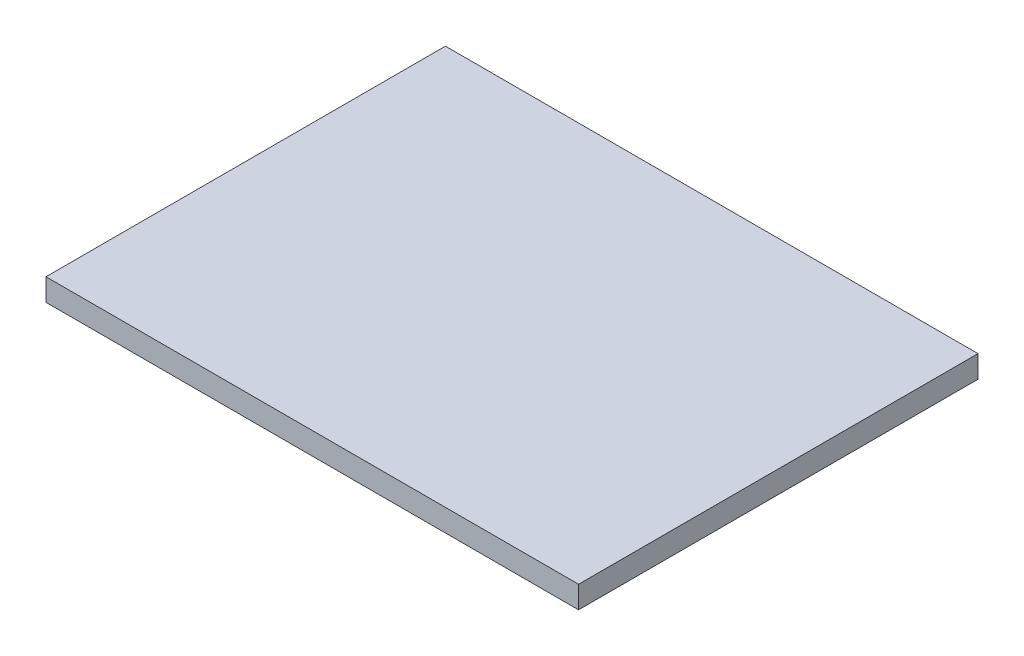
ISO-10303-21;
HEADER;
FILE_DESCRIPTION(('STEP AP214'),'2;1');
FILE_NAME('part.step','',(''),(''),'','','');
FILE_SCHEMA(('AUTOMOTIVE_DESIGN { 1 0 10303 214 1 1 1 1 }'));
ENDSEC;
DATA;
#1=APPLICATION_CONTEXT('core data for automotive mechanical design processes');
#2=APPLICATION_PROTOCOL_DEFINITION('international standard','automotive_design',2000,#1);
#3=PRODUCT_CONTEXT('',#1,'mechanical');
#4=PRODUCT('Part','Part','',(#3));
#5=PRODUCT_RELATED_PRODUCT_CATEGORY('part','',(#4));
#6=PRODUCT_DEFINITION_FORMATION('','',#4);
#7=PRODUCT_DEFINITION_CONTEXT('part definition',#1,'design');
#8=PRODUCT_DEFINITION('design','',#6,#7);
#9=PRODUCT_DEFINITION_SHAPE('','',#8);
#10=(LENGTH_UNIT() NAMED_UNIT(*) SI_UNIT(.MILLI.,.METRE.));
#11=(NAMED_UNIT(*) PLANE_ANGLE_UNIT() SI_UNIT($,.RADIAN.));
#12=(NAMED_UNIT(*) SI_UNIT($,.STERADIAN.) SOLID_ANGLE_UNIT());
#13=UNCERTAINTY_MEASURE_WITH_UNIT(LENGTH_MEASURE(1.E-05),#10,'distance_accuracy_value','');
#14=(GEOMETRIC_REPRESENTATION_CONTEXT(3) GLOBAL_UNCERTAINTY_ASSIGNED_CONTEXT((#13)) GLOBAL_UNIT_ASSIGNED_CONTEXT((#10,
#11,#12)) REPRESENTATION_CONTEXT('',''));
#15=CARTESIAN_POINT('',(0.,0.,0.));
#16=DIRECTION('',(0.,0.,1.));
#17=DIRECTION('',(1.,0.,0.));
#18=AXIS2_PLACEMENT_3D('',#15,#16,#17);
#19=CARTESIAN_POINT('',(-60.,5.,-45.));
#20=DIRECTION('',(1.,0.,0.));
#21=DIRECTION('',(0.,0.,-1.));
#22=AXIS2_PLACEMENT_3D('',#19,#20,#21);
#23=PLANE('',#22);
#24=DIRECTION('',(0.,0.,1.));
#25=VECTOR('',#24,1.);
#26=CARTESIAN_POINT('',(-60.,0.,-45.));
#27=LINE('',#26,#25);
#28=CARTESIAN_POINT('',(-60.,0.,-45.));
#29=VERTEX_POINT('',#28);
#30=CARTESIAN_POINT('',(-60.,0.,45.));
#31=VERTEX_POINT('',#30);
#32=EDGE_CURVE('E102',#29,#31,#27,.T.);
#33=ORIENTED_EDGE('',*,*,#32,.T.);
#34=DIRECTION('',(0.,-1.,0.));
#35=VECTOR('',#34,1.);
#36=CARTESIAN_POINT('',(-60.,5.,45.));
#37=LINE('',#36,#35);
#38=CARTESIAN_POINT('',(-60.,5.,45.));
#39=VERTEX_POINT('',#38);
#40=EDGE_CURVE('E11',#39,#31,#37,.T.);
#41=ORIENTED_EDGE('',*,*,#40,.F.);
#42=DIRECTION('',(0.,0.,1.));
#43=VECTOR('',#42,1.);
#44=CARTESIAN_POINT('',(-60.,5.,-45.));
#45=LINE('',#44,#43);
#46=CARTESIAN_POINT('',(-60.,5.,-45.));
#47=VERTEX_POINT('',#46);
#48=EDGE_CURVE('E90',#47,#39,#45,.T.);
#49=ORIENTED_EDGE('',*,*,#48,.F.);
#50=DIRECTION('',(0.,-1.,0.));
#51=VECTOR('',#50,1.);
#52=CARTESIAN_POINT('',(-60.,5.,-45.));
#53=LINE('',#52,#51);
#54=EDGE_CURVE('E98',#47,#29,#53,.T.);
#55=ORIENTED_EDGE('',*,*,#54,.T.);
#56=EDGE_LOOP('',(#33,#41,#49,#55));
#57=FACE_BOUND('',#56,.T.);
#58=ADVANCED_FACE('F39',(#57),#23,.F.);
#59=CARTESIAN_POINT('',(-60.,5.,45.));
#60=DIRECTION('',(0.,0.,-1.));
#61=DIRECTION('',(-1.,0.,0.));
#62=AXIS2_PLACEMENT_3D('',#59,#60,#61);
#63=PLANE('',#62);
#64=DIRECTION('',(1.,0.,0.));
#65=VECTOR('',#64,1.);
#66=CARTESIAN_POINT('',(-60.,0.,45.));
#67=LINE('',#66,#65);
#68=CARTESIAN_POINT('',(60.,0.,45.));
#69=VERTEX_POINT('',#68);
#70=EDGE_CURVE('E94',#31,#69,#67,.T.);
#71=ORIENTED_EDGE('',*,*,#70,.T.);
#72=DIRECTION('',(0.,-1.,0.));
#73=VECTOR('',#72,1.);
#74=CARTESIAN_POINT('',(60.,5.,45.));
#75=LINE('',#74,#73);
#76=CARTESIAN_POINT('',(60.,5.,45.));
#77=VERTEX_POINT('',#76);
#78=EDGE_CURVE('E47',#77,#69,#75,.T.);
#79=ORIENTED_EDGE('',*,*,#78,.F.);
#80=DIRECTION('',(1.,0.,0.));
#81=VECTOR('',#80,1.);
#82=CARTESIAN_POINT('',(-60.,5.,45.));
#83=LINE('',#82,#81);
#84=EDGE_CURVE('E85',#39,#77,#83,.T.);
#85=ORIENTED_EDGE('',*,*,#84,.F.);
#86=ORIENTED_EDGE('',*,*,#40,.T.);
#87=EDGE_LOOP('',(#71,#79,#85,#86));
#88=FACE_BOUND('',#87,.T.);
#89=ADVANCED_FACE('F93',(#88),#63,.F.);
#90=CARTESIAN_POINT('',(60.,5.,-45.));
#91=DIRECTION('',(-1.,0.,0.));
#92=DIRECTION('',(0.,0.,1.));
#93=AXIS2_PLACEMENT_3D('',#90,#91,#92);
#94=PLANE('',#93);
#95=DIRECTION('',(0.,0.,-1.));
#96=VECTOR('',#95,1.);
#97=CARTESIAN_POINT('',(60.,0.,-45.));
#98=LINE('',#97,#96);
#99=CARTESIAN_POINT('',(60.,0.,-45.));
#100=VERTEX_POINT('',#99);
#101=EDGE_CURVE('E72',#69,#100,#98,.T.);
#102=ORIENTED_EDGE('',*,*,#101,.T.);
#103=DIRECTION('',(0.,-1.,0.));
#104=VECTOR('',#103,1.);
#105=CARTESIAN_POINT('',(60.,5.,-45.));
#106=LINE('',#105,#104);
#107=CARTESIAN_POINT('',(60.,5.,-45.));
#108=VERTEX_POINT('',#107);
#109=EDGE_CURVE('E95',#108,#100,#106,.T.);
#110=ORIENTED_EDGE('',*,*,#109,.F.);
#111=DIRECTION('',(0.,0.,-1.));
#112=VECTOR('',#111,1.);
#113=CARTESIAN_POINT('',(60.,5.,-45.));
#114=LINE('',#113,#112);
#115=EDGE_CURVE('E88',#77,#108,#114,.T.);
#116=ORIENTED_EDGE('',*,*,#115,.F.);
#117=ORIENTED_EDGE('',*,*,#78,.T.);
#118=EDGE_LOOP('',(#102,#110,#116,#117));
#119=FACE_BOUND('',#118,.T.);
#120=ADVANCED_FACE('F96',(#119),#94,.F.);
#121=CARTESIAN_POINT('',(-60.,5.,-45.));
#122=DIRECTION('',(0.,0.,1.));
#123=DIRECTION('',(1.,0.,0.));
#124=AXIS2_PLACEMENT_3D('',#121,#122,#123);
#125=PLANE('',#124);
#126=DIRECTION('',(-1.,0.,0.));
#127=VECTOR('',#126,1.);
#128=CARTESIAN_POINT('',(-60.,0.,-45.));
#129=LINE('',#128,#127);
#130=EDGE_CURVE('E78',#100,#29,#129,.T.);
#131=ORIENTED_EDGE('',*,*,#130,.T.);
#132=ORIENTED_EDGE('',*,*,#54,.F.);
#133=DIRECTION('',(-1.,0.,0.));
#134=VECTOR('',#133,1.);
#135=CARTESIAN_POINT('',(-60.,5.,-45.));
#136=LINE('',#135,#134);
#137=EDGE_CURVE('E55',#108,#47,#136,.T.);
#138=ORIENTED_EDGE('',*,*,#137,.F.);
#139=ORIENTED_EDGE('',*,*,#109,.T.);
#140=EDGE_LOOP('',(#131,#132,#138,#139));
#141=FACE_BOUND('',#140,.T.);
#142=ADVANCED_FACE('F109',(#141),#125,.F.);
#143=CARTESIAN_POINT('',(0.,5.,0.));
#144=DIRECTION('',(0.,1.,0.));
#145=DIRECTION('',(0.,0.,1.));
#146=AXIS2_PLACEMENT_3D('',#143,#144,#145);
#147=PLANE('',#146);
#148=ORIENTED_EDGE('',*,*,#48,.T.);
#149=ORIENTED_EDGE('',*,*,#84,.T.);
#150=ORIENTED_EDGE('',*,*,#115,.T.);
#151=ORIENTED_EDGE('',*,*,#137,.T.);
#152=EDGE_LOOP('',(#148,#149,#150,#151));
#153=FACE_BOUND('',#152,.T.);
#154=ADVANCED_FACE('F86',(#153),#147,.T.);
#155=CARTESIAN_POINT('',(0.,0.,0.));
#156=DIRECTION('',(0.,1.,0.));
#157=DIRECTION('',(0.,0.,1.));
#158=AXIS2_PLACEMENT_3D('',#155,#156,#157);
#159=PLANE('',#158);
#160=ORIENTED_EDGE('',*,*,#32,.F.);
#161=ORIENTED_EDGE('',*,*,#130,.F.);
#162=ORIENTED_EDGE('',*,*,#101,.F.);
#163=ORIENTED_EDGE('',*,*,#70,.F.);
#164=EDGE_LOOP('',(#160,#161,#162,#163));
#165=FACE_BOUND('',#164,.T.);
#166=ADVANCED_FACE('F112',(#165),#159,.F.);
#167=CLOSED_SHELL('',(#58,#89,#120,#142,#154,#166));
#168=MANIFOLD_SOLID_BREP('B2',#167);
#169=ADVANCED_BREP_SHAPE_REPRESENTATION('',(#18,#168),#14);
#170=SHAPE_DEFINITION_REPRESENTATION(#9,#169);
ENDSEC;
END-ISO-10303-21;
